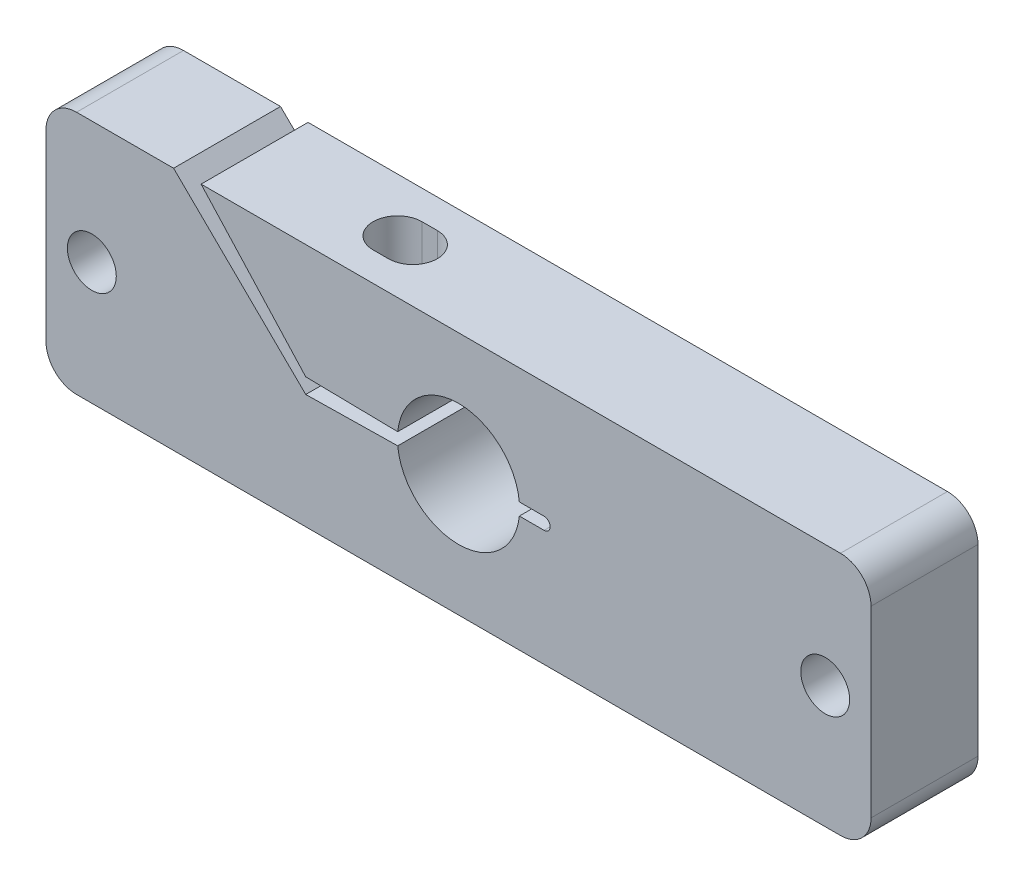
ISO-10303-21;
HEADER;
FILE_DESCRIPTION(('STEP AP214'),'2;1');
FILE_NAME('part.step','',(''),(''),'','','');
FILE_SCHEMA(('AUTOMOTIVE_DESIGN { 1 0 10303 214 1 1 1 1 }'));
ENDSEC;
DATA;
#1=APPLICATION_CONTEXT('core data for automotive mechanical design processes');
#2=APPLICATION_PROTOCOL_DEFINITION('international standard','automotive_design',2000,#1);
#3=PRODUCT_CONTEXT('',#1,'mechanical');
#4=PRODUCT('Part','Part','',(#3));
#5=PRODUCT_RELATED_PRODUCT_CATEGORY('part','',(#4));
#6=PRODUCT_DEFINITION_FORMATION('','',#4);
#7=PRODUCT_DEFINITION_CONTEXT('part definition',#1,'design');
#8=PRODUCT_DEFINITION('design','',#6,#7);
#9=PRODUCT_DEFINITION_SHAPE('','',#8);
#10=(LENGTH_UNIT() NAMED_UNIT(*) SI_UNIT(.MILLI.,.METRE.));
#11=(NAMED_UNIT(*) PLANE_ANGLE_UNIT() SI_UNIT($,.RADIAN.));
#12=(NAMED_UNIT(*) SI_UNIT($,.STERADIAN.) SOLID_ANGLE_UNIT());
#13=UNCERTAINTY_MEASURE_WITH_UNIT(LENGTH_MEASURE(1.E-05),#10,'distance_accuracy_value','');
#14=(GEOMETRIC_REPRESENTATION_CONTEXT(3) GLOBAL_UNCERTAINTY_ASSIGNED_CONTEXT((#13)) GLOBAL_UNIT_ASSIGNED_CONTEXT((#10,
#11,#12)) REPRESENTATION_CONTEXT('',''));
#15=CARTESIAN_POINT('',(0.,0.,0.));
#16=DIRECTION('',(0.,0.,1.));
#17=DIRECTION('',(1.,0.,0.));
#18=AXIS2_PLACEMENT_3D('',#15,#16,#17);
#19=CARTESIAN_POINT('',(5.6,0.,-3.5));
#20=DIRECTION('',(0.,0.,1.));
#21=DIRECTION('',(1.,0.,0.));
#22=AXIS2_PLACEMENT_3D('',#19,#20,#21);
#23=CYLINDRICAL_SURFACE('',#22,0.4);
#24=DIRECTION('',(0.,0.,-1.));
#25=VECTOR('',#24,1.);
#26=CARTESIAN_POINT('',(5.6,0.4,-3.5));
#27=LINE('',#26,#25);
#28=CARTESIAN_POINT('',(5.6,0.4,-3.5));
#29=VERTEX_POINT('',#28);
#30=CARTESIAN_POINT('',(5.6,0.4,3.5));
#31=VERTEX_POINT('',#30);
#32=EDGE_CURVE('E381',#29,#31,#27,.F.);
#33=ORIENTED_EDGE('',*,*,#32,.F.);
#34=CARTESIAN_POINT('',(5.6,0.,-3.5));
#35=DIRECTION('',(0.,0.,1.));
#36=DIRECTION('',(1.,0.,0.));
#37=AXIS2_PLACEMENT_3D('',#34,#35,#36);
#38=CIRCLE('',#37,0.4);
#39=CARTESIAN_POINT('',(5.6,-0.4,-3.5));
#40=VERTEX_POINT('',#39);
#41=EDGE_CURVE('E52',#29,#40,#38,.F.);
#42=ORIENTED_EDGE('',*,*,#41,.T.);
#43=DIRECTION('',(0.,0.,-1.));
#44=VECTOR('',#43,1.);
#45=CARTESIAN_POINT('',(5.6,-0.4,-3.5));
#46=LINE('',#45,#44);
#47=CARTESIAN_POINT('',(5.6,-0.4,3.5));
#48=VERTEX_POINT('',#47);
#49=EDGE_CURVE('E390',#48,#40,#46,.T.);
#50=ORIENTED_EDGE('',*,*,#49,.F.);
#51=CARTESIAN_POINT('',(5.6,0.,3.5));
#52=DIRECTION('',(0.,0.,1.));
#53=DIRECTION('',(1.,0.,0.));
#54=AXIS2_PLACEMENT_3D('',#51,#52,#53);
#55=CIRCLE('',#54,0.4);
#56=EDGE_CURVE('E11',#48,#31,#55,.T.);
#57=ORIENTED_EDGE('',*,*,#56,.T.);
#58=EDGE_LOOP('',(#33,#42,#50,#57));
#59=FACE_BOUND('',#58,.T.);
#60=ADVANCED_FACE('F44',(#59),#23,.F.);
#61=CARTESIAN_POINT('',(-6.98997487421324,8.00100000000001,0.));
#62=DIRECTION('',(0.,-1.,0.));
#63=DIRECTION('',(0.,0.,-1.));
#64=AXIS2_PLACEMENT_3D('',#61,#62,#63);
#65=CYLINDRICAL_SURFACE('',#64,1.6);
#66=CARTESIAN_POINT('',(-6.98997487421324,-0.450000000000001,0.));
#67=DIRECTION('',(-0.0166088657318921,0.99986206327628,0.));
#68=DIRECTION('',(-0.99986206327628,-0.0166088657318921,0.));
#69=AXIS2_PLACEMENT_3D('',#66,#67,#68);
#70=ELLIPSE('',#69,1.60022072920462,1.6);
#71=CARTESIAN_POINT('',(-8.58997487421324,-0.476577851232751,0.));
#72=VERTEX_POINT('',#71);
#73=EDGE_CURVE('E239',#72,#72,#70,.F.);
#74=ORIENTED_EDGE('',*,*,#73,.F.);
#75=EDGE_LOOP('',(#74));
#76=FACE_BOUND('',#75,.T.);
#77=CARTESIAN_POINT('',(-6.98997487421324,-1.99999999999999,0.));
#78=DIRECTION('',(0.,-1.,0.));
#79=DIRECTION('',(0.,0.,-1.));
#80=AXIS2_PLACEMENT_3D('',#77,#78,#79);
#81=CIRCLE('',#80,1.6);
#82=CARTESIAN_POINT('',(-6.98997487421324,-1.99999999999999,-1.6));
#83=VERTEX_POINT('',#82);
#84=EDGE_CURVE('E215',#83,#83,#81,.T.);
#85=ORIENTED_EDGE('',*,*,#84,.T.);
#86=EDGE_LOOP('',(#85));
#87=FACE_BOUND('',#86,.T.);
#88=ADVANCED_FACE('F461',(#76,#87),#65,.F.);
#89=CARTESIAN_POINT('',(0.,0.,-3.5));
#90=DIRECTION('',(0.,0.,1.));
#91=DIRECTION('',(1.,0.,0.));
#92=AXIS2_PLACEMENT_3D('',#89,#90,#91);
#93=CYLINDRICAL_SURFACE('',#92,4.);
#94=DIRECTION('',(0.,0.,1.));
#95=VECTOR('',#94,1.);
#96=CARTESIAN_POINT('',(3.97994974842648,0.4,-3.5));
#97=LINE('',#96,#95);
#98=CARTESIAN_POINT('',(3.97994974842648,0.4,-3.5));
#99=VERTEX_POINT('',#98);
#100=CARTESIAN_POINT('',(3.97994974842648,0.4,3.5));
#101=VERTEX_POINT('',#100);
#102=EDGE_CURVE('E328',#99,#101,#97,.T.);
#103=ORIENTED_EDGE('',*,*,#102,.T.);
#104=CARTESIAN_POINT('',(0.,0.,3.5));
#105=DIRECTION('',(0.,0.,-1.));
#106=DIRECTION('',(1.,0.,0.));
#107=AXIS2_PLACEMENT_3D('',#104,#105,#106);
#108=CIRCLE('',#107,4.);
#109=CARTESIAN_POINT('',(-3.97994974842648,0.4,3.5));
#110=VERTEX_POINT('',#109);
#111=EDGE_CURVE('E252',#110,#101,#108,.T.);
#112=ORIENTED_EDGE('',*,*,#111,.F.);
#113=DIRECTION('',(0.,0.,1.));
#114=VECTOR('',#113,1.);
#115=CARTESIAN_POINT('',(-3.97994974842648,0.4,-3.5));
#116=LINE('',#115,#114);
#117=CARTESIAN_POINT('',(-3.97994974842648,0.4,-3.5));
#118=VERTEX_POINT('',#117);
#119=EDGE_CURVE('E333',#118,#110,#116,.T.);
#120=ORIENTED_EDGE('',*,*,#119,.F.);
#121=CARTESIAN_POINT('',(0.,0.,-3.5));
#122=DIRECTION('',(0.,0.,-1.));
#123=DIRECTION('',(1.,0.,0.));
#124=AXIS2_PLACEMENT_3D('',#121,#122,#123);
#125=CIRCLE('',#124,4.);
#126=EDGE_CURVE('E291',#118,#99,#125,.T.);
#127=ORIENTED_EDGE('',*,*,#126,.T.);
#128=EDGE_LOOP('',(#103,#112,#120,#127));
#129=FACE_BOUND('',#128,.T.);
#130=ADVANCED_FACE('F458',(#129),#93,.F.);
#131=CARTESIAN_POINT('',(-10.,0.5,-3.5));
#132=DIRECTION('',(-0.0166088657318921,-0.99986206327628,0.));
#133=DIRECTION('',(0.99986206327628,-0.0166088657318921,0.));
#134=AXIS2_PLACEMENT_3D('',#131,#132,#133);
#135=PLANE('',#134);
#136=CARTESIAN_POINT('',(-7.48997487421324,0.458305578510235,0.));
#137=DIRECTION('',(-0.0166088657318921,-0.99986206327628,0.));
#138=DIRECTION('',(-0.99986206327628,0.0166088657318921,0.));
#139=AXIS2_PLACEMENT_3D('',#136,#137,#138);
#140=ELLIPSE('',#139,1.60022072920462,1.6);
#141=CARTESIAN_POINT('',(-7.48997487421324,0.458305578510235,-1.6));
#142=VERTEX_POINT('',#141);
#143=CARTESIAN_POINT('',(-7.48997487421324,0.458305578510235,1.6));
#144=VERTEX_POINT('',#143);
#145=EDGE_CURVE('E199',#142,#144,#140,.F.);
#146=ORIENTED_EDGE('',*,*,#145,.T.);
#147=DIRECTION('',(0.99986206327628,-0.0166088657318921,0.));
#148=VECTOR('',#147,1.);
#149=CARTESIAN_POINT('',(-7.34949478371137,0.455972041668659,1.6));
#150=LINE('',#149,#148);
#151=CARTESIAN_POINT('',(-6.48997487421324,0.441694421489766,1.6));
#152=VERTEX_POINT('',#151);
#153=EDGE_CURVE('E222',#144,#152,#150,.T.);
#154=ORIENTED_EDGE('',*,*,#153,.T.);
#155=CARTESIAN_POINT('',(-6.48997487421324,0.441694421489766,0.));
#156=DIRECTION('',(-0.0166088657318921,-0.99986206327628,0.));
#157=DIRECTION('',(-0.99986206327628,0.0166088657318921,0.));
#158=AXIS2_PLACEMENT_3D('',#155,#156,#157);
#159=ELLIPSE('',#158,1.60022072920462,1.6);
#160=CARTESIAN_POINT('',(-6.48997487421324,0.441694421489766,-1.6));
#161=VERTEX_POINT('',#160);
#162=EDGE_CURVE('E203',#152,#161,#159,.F.);
#163=ORIENTED_EDGE('',*,*,#162,.T.);
#164=DIRECTION('',(-0.99986206327628,0.0166088657318921,0.));
#165=VECTOR('',#164,1.);
#166=CARTESIAN_POINT('',(-7.34949478371137,0.455972041668659,-1.6));
#167=LINE('',#166,#165);
#168=EDGE_CURVE('E204',#161,#142,#167,.T.);
#169=ORIENTED_EDGE('',*,*,#168,.T.);
#170=EDGE_LOOP('',(#146,#154,#163,#169));
#171=FACE_BOUND('',#170,.T.);
#172=ORIENTED_EDGE('',*,*,#119,.T.);
#173=DIRECTION('',(0.99986206327628,-0.0166088657318921,0.));
#174=VECTOR('',#173,1.);
#175=CARTESIAN_POINT('',(-10.,0.5,3.5));
#176=LINE('',#175,#174);
#177=CARTESIAN_POINT('',(-10.,0.5,3.5));
#178=VERTEX_POINT('',#177);
#179=EDGE_CURVE('E281',#178,#110,#176,.T.);
#180=ORIENTED_EDGE('',*,*,#179,.F.);
#181=DIRECTION('',(0.,0.,1.));
#182=VECTOR('',#181,1.);
#183=CARTESIAN_POINT('',(-10.,0.5,-3.5));
#184=LINE('',#183,#182);
#185=CARTESIAN_POINT('',(-10.,0.5,-3.5));
#186=VERTEX_POINT('',#185);
#187=EDGE_CURVE('E335',#186,#178,#184,.T.);
#188=ORIENTED_EDGE('',*,*,#187,.F.);
#189=DIRECTION('',(0.99986206327628,-0.0166088657318921,0.));
#190=VECTOR('',#189,1.);
#191=CARTESIAN_POINT('',(-10.,0.5,-3.5));
#192=LINE('',#191,#190);
#193=EDGE_CURVE('E330',#186,#118,#192,.T.);
#194=ORIENTED_EDGE('',*,*,#193,.T.);
#195=EDGE_LOOP('',(#172,#180,#188,#194));
#196=FACE_BOUND('',#195,.T.);
#197=ADVANCED_FACE('F457',(#171,#196),#135,.T.);
#198=CARTESIAN_POINT('',(-10.,0.5,-3.5));
#199=DIRECTION('',(-0.73845534062588,-0.674302387583728,0.));
#200=DIRECTION('',(0.674302387583728,-0.73845534062588,0.));
#201=AXIS2_PLACEMENT_3D('',#198,#199,#200);
#202=PLANE('',#201);
#203=ORIENTED_EDGE('',*,*,#187,.T.);
#204=DIRECTION('',(0.674302387583728,-0.73845534062588,0.));
#205=VECTOR('',#204,1.);
#206=CARTESIAN_POINT('',(-10.,0.5,3.5));
#207=LINE('',#206,#205);
#208=CARTESIAN_POINT('',(-16.8484411021954,8.,3.5));
#209=VERTEX_POINT('',#208);
#210=EDGE_CURVE('E282',#209,#178,#207,.T.);
#211=ORIENTED_EDGE('',*,*,#210,.F.);
#212=DIRECTION('',(0.,0.,1.));
#213=VECTOR('',#212,1.);
#214=CARTESIAN_POINT('',(-16.8484411021954,8.,-3.5));
#215=LINE('',#214,#213);
#216=CARTESIAN_POINT('',(-16.8484411021954,8.,-3.5));
#217=VERTEX_POINT('',#216);
#218=EDGE_CURVE('E337',#217,#209,#215,.T.);
#219=ORIENTED_EDGE('',*,*,#218,.F.);
#220=DIRECTION('',(0.674302387583728,-0.73845534062588,0.));
#221=VECTOR('',#220,1.);
#222=CARTESIAN_POINT('',(-10.,0.5,-3.5));
#223=LINE('',#222,#221);
#224=EDGE_CURVE('E324',#217,#186,#223,.T.);
#225=ORIENTED_EDGE('',*,*,#224,.T.);
#226=EDGE_LOOP('',(#203,#211,#219,#225));
#227=FACE_BOUND('',#226,.T.);
#228=ADVANCED_FACE('F455',(#227),#202,.T.);
#229=CARTESIAN_POINT('',(-16.8484411021954,8.,-3.5));
#230=DIRECTION('',(0.,1.,0.));
#231=DIRECTION('',(-1.,0.,0.));
#232=AXIS2_PLACEMENT_3D('',#229,#230,#231);
#233=PLANE('',#232);
#234=CARTESIAN_POINT('',(-7.48997487421324,8.,0.));
#235=DIRECTION('',(0.,1.,0.));
#236=DIRECTION('',(0.,0.,1.));
#237=AXIS2_PLACEMENT_3D('',#234,#235,#236);
#238=CIRCLE('',#237,1.6);
#239=CARTESIAN_POINT('',(-7.48997487421324,8.,-1.6));
#240=VERTEX_POINT('',#239);
#241=CARTESIAN_POINT('',(-7.48997487421324,8.,1.6));
#242=VERTEX_POINT('',#241);
#243=EDGE_CURVE('E192',#240,#242,#238,.T.);
#244=ORIENTED_EDGE('',*,*,#243,.F.);
#245=DIRECTION('',(-1.,0.,0.));
#246=VECTOR('',#245,1.);
#247=CARTESIAN_POINT('',(-7.48997487421324,8.,-1.6));
#248=LINE('',#247,#246);
#249=CARTESIAN_POINT('',(-6.48997487421324,8.,-1.6));
#250=VERTEX_POINT('',#249);
#251=EDGE_CURVE('E201',#250,#240,#248,.T.);
#252=ORIENTED_EDGE('',*,*,#251,.F.);
#253=CARTESIAN_POINT('',(-6.48997487421324,8.,0.));
#254=DIRECTION('',(0.,1.,0.));
#255=DIRECTION('',(0.,0.,1.));
#256=AXIS2_PLACEMENT_3D('',#253,#254,#255);
#257=CIRCLE('',#256,1.6);
#258=CARTESIAN_POINT('',(-6.48997487421324,8.,1.6));
#259=VERTEX_POINT('',#258);
#260=EDGE_CURVE('E211',#259,#250,#257,.T.);
#261=ORIENTED_EDGE('',*,*,#260,.F.);
#262=DIRECTION('',(1.,0.,0.));
#263=VECTOR('',#262,1.);
#264=CARTESIAN_POINT('',(-7.48997487421324,8.,1.6));
#265=LINE('',#264,#263);
#266=EDGE_CURVE('E216',#242,#259,#265,.T.);
#267=ORIENTED_EDGE('',*,*,#266,.F.);
#268=EDGE_LOOP('',(#244,#252,#261,#267));
#269=FACE_BOUND('',#268,.T.);
#270=DIRECTION('',(-1.,0.,0.));
#271=VECTOR('',#270,1.);
#272=CARTESIAN_POINT('',(-16.8484411021954,8.,3.5));
#273=LINE('',#272,#271);
#274=CARTESIAN_POINT('',(25.,8.00000000000001,3.5));
#275=VERTEX_POINT('',#274);
#276=EDGE_CURVE('E279',#275,#209,#273,.T.);
#277=ORIENTED_EDGE('',*,*,#276,.F.);
#278=DIRECTION('',(0.,0.,1.));
#279=VECTOR('',#278,1.);
#280=CARTESIAN_POINT('',(25.,8.00000000000001,-3.5));
#281=LINE('',#280,#279);
#282=CARTESIAN_POINT('',(25.,8.00000000000001,-3.5));
#283=VERTEX_POINT('',#282);
#284=EDGE_CURVE('E378',#275,#283,#281,.F.);
#285=ORIENTED_EDGE('',*,*,#284,.T.);
#286=DIRECTION('',(-1.,0.,0.));
#287=VECTOR('',#286,1.);
#288=CARTESIAN_POINT('',(-16.8484411021954,8.,-3.5));
#289=LINE('',#288,#287);
#290=EDGE_CURVE('E325',#283,#217,#289,.T.);
#291=ORIENTED_EDGE('',*,*,#290,.T.);
#292=ORIENTED_EDGE('',*,*,#218,.T.);
#293=EDGE_LOOP('',(#277,#285,#291,#292));
#294=FACE_BOUND('',#293,.T.);
#295=ADVANCED_FACE('F217',(#269,#294),#233,.T.);
#296=CARTESIAN_POINT('',(27.,8.00000000000001,-3.5));
#297=DIRECTION('',(1.,0.,0.));
#298=DIRECTION('',(0.,1.,0.));
#299=AXIS2_PLACEMENT_3D('',#296,#297,#298);
#300=PLANE('',#299);
#301=DIRECTION('',(0.,1.,0.));
#302=VECTOR('',#301,1.);
#303=CARTESIAN_POINT('',(27.,8.00000000000001,3.5));
#304=LINE('',#303,#302);
#305=CARTESIAN_POINT('',(27.,-5.99999999999999,3.5));
#306=VERTEX_POINT('',#305);
#307=CARTESIAN_POINT('',(27.,6.00000000000001,3.5));
#308=VERTEX_POINT('',#307);
#309=EDGE_CURVE('E278',#306,#308,#304,.T.);
#310=ORIENTED_EDGE('',*,*,#309,.F.);
#311=DIRECTION('',(0.,0.,1.));
#312=VECTOR('',#311,1.);
#313=CARTESIAN_POINT('',(27.,-5.99999999999999,-3.5));
#314=LINE('',#313,#312);
#315=CARTESIAN_POINT('',(27.,-5.99999999999999,-3.5));
#316=VERTEX_POINT('',#315);
#317=EDGE_CURVE('E380',#306,#316,#314,.F.);
#318=ORIENTED_EDGE('',*,*,#317,.T.);
#319=DIRECTION('',(0.,1.,0.));
#320=VECTOR('',#319,1.);
#321=CARTESIAN_POINT('',(27.,8.00000000000001,-3.5));
#322=LINE('',#321,#320);
#323=CARTESIAN_POINT('',(27.,6.00000000000001,-3.5));
#324=VERTEX_POINT('',#323);
#325=EDGE_CURVE('E316',#316,#324,#322,.T.);
#326=ORIENTED_EDGE('',*,*,#325,.T.);
#327=DIRECTION('',(0.,0.,1.));
#328=VECTOR('',#327,1.);
#329=CARTESIAN_POINT('',(27.,6.00000000000001,-3.5));
#330=LINE('',#329,#328);
#331=EDGE_CURVE('E372',#324,#308,#330,.T.);
#332=ORIENTED_EDGE('',*,*,#331,.T.);
#333=EDGE_LOOP('',(#310,#318,#326,#332));
#334=FACE_BOUND('',#333,.T.);
#335=ADVANCED_FACE('F437',(#334),#300,.T.);
#336=CARTESIAN_POINT('',(-27.,-8.,-3.5));
#337=DIRECTION('',(0.,-1.,0.));
#338=DIRECTION('',(1.,0.,0.));
#339=AXIS2_PLACEMENT_3D('',#336,#337,#338);
#340=PLANE('',#339);
#341=CARTESIAN_POINT('',(-6.98997487421324,-7.99999999999999,0.));
#342=DIRECTION('',(0.,-1.,0.));
#343=DIRECTION('',(0.,0.,-1.));
#344=AXIS2_PLACEMENT_3D('',#341,#342,#343);
#345=CIRCLE('',#344,2.2);
#346=CARTESIAN_POINT('',(-6.98997487421324,-7.99999999999999,-2.2));
#347=VERTEX_POINT('',#346);
#348=EDGE_CURVE('E236',#347,#347,#345,.T.);
#349=ORIENTED_EDGE('',*,*,#348,.F.);
#350=EDGE_LOOP('',(#349));
#351=FACE_BOUND('',#350,.T.);
#352=DIRECTION('',(1.,0.,0.));
#353=VECTOR('',#352,1.);
#354=CARTESIAN_POINT('',(-27.,-8.,3.5));
#355=LINE('',#354,#353);
#356=CARTESIAN_POINT('',(-25.,-8.,3.5));
#357=VERTEX_POINT('',#356);
#358=CARTESIAN_POINT('',(25.,-7.99999999999999,3.5));
#359=VERTEX_POINT('',#358);
#360=EDGE_CURVE('E271',#357,#359,#355,.T.);
#361=ORIENTED_EDGE('',*,*,#360,.F.);
#362=DIRECTION('',(0.,0.,1.));
#363=VECTOR('',#362,1.);
#364=CARTESIAN_POINT('',(-25.,-8.,-3.5));
#365=LINE('',#364,#363);
#366=CARTESIAN_POINT('',(-25.,-8.,-3.5));
#367=VERTEX_POINT('',#366);
#368=EDGE_CURVE('E364',#357,#367,#365,.F.);
#369=ORIENTED_EDGE('',*,*,#368,.T.);
#370=DIRECTION('',(1.,0.,0.));
#371=VECTOR('',#370,1.);
#372=CARTESIAN_POINT('',(-27.,-8.,-3.5));
#373=LINE('',#372,#371);
#374=CARTESIAN_POINT('',(25.,-7.99999999999999,-3.5));
#375=VERTEX_POINT('',#374);
#376=EDGE_CURVE('E317',#367,#375,#373,.T.);
#377=ORIENTED_EDGE('',*,*,#376,.T.);
#378=DIRECTION('',(0.,0.,1.));
#379=VECTOR('',#378,1.);
#380=CARTESIAN_POINT('',(25.,-7.99999999999999,-3.5));
#381=LINE('',#380,#379);
#382=EDGE_CURVE('E363',#375,#359,#381,.T.);
#383=ORIENTED_EDGE('',*,*,#382,.T.);
#384=EDGE_LOOP('',(#361,#369,#377,#383));
#385=FACE_BOUND('',#384,.T.);
#386=ADVANCED_FACE('F431',(#351,#385),#340,.T.);
#387=CARTESIAN_POINT('',(-27.,8.,-3.5));
#388=DIRECTION('',(-1.,0.,0.));
#389=DIRECTION('',(0.,0.,1.));
#390=AXIS2_PLACEMENT_3D('',#387,#388,#389);
#391=PLANE('',#390);
#392=DIRECTION('',(0.,-1.,0.));
#393=VECTOR('',#392,1.);
#394=CARTESIAN_POINT('',(-27.,8.,-3.5));
#395=LINE('',#394,#393);
#396=CARTESIAN_POINT('',(-27.,6.,-3.5));
#397=VERTEX_POINT('',#396);
#398=CARTESIAN_POINT('',(-27.,-6.,-3.5));
#399=VERTEX_POINT('',#398);
#400=EDGE_CURVE('E312',#397,#399,#395,.T.);
#401=ORIENTED_EDGE('',*,*,#400,.T.);
#402=DIRECTION('',(0.,0.,1.));
#403=VECTOR('',#402,1.);
#404=CARTESIAN_POINT('',(-27.,-6.,-3.5));
#405=LINE('',#404,#403);
#406=CARTESIAN_POINT('',(-27.,-6.,3.5));
#407=VERTEX_POINT('',#406);
#408=EDGE_CURVE('E348',#399,#407,#405,.T.);
#409=ORIENTED_EDGE('',*,*,#408,.T.);
#410=DIRECTION('',(0.,-1.,0.));
#411=VECTOR('',#410,1.);
#412=CARTESIAN_POINT('',(-27.,8.,3.5));
#413=LINE('',#412,#411);
#414=CARTESIAN_POINT('',(-27.,6.,3.5));
#415=VERTEX_POINT('',#414);
#416=EDGE_CURVE('E266',#415,#407,#413,.T.);
#417=ORIENTED_EDGE('',*,*,#416,.F.);
#418=DIRECTION('',(0.,0.,1.));
#419=VECTOR('',#418,1.);
#420=CARTESIAN_POINT('',(-27.,6.,-3.5));
#421=LINE('',#420,#419);
#422=EDGE_CURVE('E332',#415,#397,#421,.F.);
#423=ORIENTED_EDGE('',*,*,#422,.T.);
#424=EDGE_LOOP('',(#401,#409,#417,#423));
#425=FACE_BOUND('',#424,.T.);
#426=ADVANCED_FACE('F421',(#425),#391,.T.);
#427=CARTESIAN_POINT('',(-27.,8.,-3.5));
#428=DIRECTION('',(0.,1.,0.));
#429=DIRECTION('',(-1.,0.,0.));
#430=AXIS2_PLACEMENT_3D('',#427,#428,#429);
#431=PLANE('',#430);
#432=DIRECTION('',(-1.,0.,0.));
#433=VECTOR('',#432,1.);
#434=CARTESIAN_POINT('',(-27.,8.,-3.5));
#435=LINE('',#434,#433);
#436=CARTESIAN_POINT('',(-18.6496628402632,8.,-3.5));
#437=VERTEX_POINT('',#436);
#438=CARTESIAN_POINT('',(-25.,8.,-3.5));
#439=VERTEX_POINT('',#438);
#440=EDGE_CURVE('E309',#437,#439,#435,.T.);
#441=ORIENTED_EDGE('',*,*,#440,.T.);
#442=DIRECTION('',(0.,0.,1.));
#443=VECTOR('',#442,1.);
#444=CARTESIAN_POINT('',(-25.,8.,-3.5));
#445=LINE('',#444,#443);
#446=CARTESIAN_POINT('',(-25.,8.,3.5));
#447=VERTEX_POINT('',#446);
#448=EDGE_CURVE('E382',#439,#447,#445,.T.);
#449=ORIENTED_EDGE('',*,*,#448,.T.);
#450=DIRECTION('',(-1.,0.,0.));
#451=VECTOR('',#450,1.);
#452=CARTESIAN_POINT('',(-27.,8.,3.5));
#453=LINE('',#452,#451);
#454=CARTESIAN_POINT('',(-18.6496628402632,8.,3.5));
#455=VERTEX_POINT('',#454);
#456=EDGE_CURVE('E269',#455,#447,#453,.T.);
#457=ORIENTED_EDGE('',*,*,#456,.F.);
#458=DIRECTION('',(0.,0.,1.));
#459=VECTOR('',#458,1.);
#460=CARTESIAN_POINT('',(-18.6496628402632,8.,-3.5));
#461=LINE('',#460,#459);
#462=EDGE_CURVE('E339',#437,#455,#461,.T.);
#463=ORIENTED_EDGE('',*,*,#462,.F.);
#464=EDGE_LOOP('',(#441,#449,#457,#463));
#465=FACE_BOUND('',#464,.T.);
#466=ADVANCED_FACE('F418',(#465),#431,.T.);
#467=CARTESIAN_POINT('',(-10.,-0.5,-3.5));
#468=DIRECTION('',(0.700909264299847,0.713250449154186,0.));
#469=DIRECTION('',(-0.713250449154186,0.700909264299847,0.));
#470=AXIS2_PLACEMENT_3D('',#467,#468,#469);
#471=PLANE('',#470);
#472=ORIENTED_EDGE('',*,*,#462,.T.);
#473=DIRECTION('',(-0.713250449154186,0.700909264299847,0.));
#474=VECTOR('',#473,1.);
#475=CARTESIAN_POINT('',(-10.,-0.5,3.5));
#476=LINE('',#475,#474);
#477=CARTESIAN_POINT('',(-10.,-0.5,3.5));
#478=VERTEX_POINT('',#477);
#479=EDGE_CURVE('E261',#478,#455,#476,.T.);
#480=ORIENTED_EDGE('',*,*,#479,.F.);
#481=DIRECTION('',(0.,0.,1.));
#482=VECTOR('',#481,1.);
#483=CARTESIAN_POINT('',(-10.,-0.5,-3.5));
#484=LINE('',#483,#482);
#485=CARTESIAN_POINT('',(-10.,-0.5,-3.5));
#486=VERTEX_POINT('',#485);
#487=EDGE_CURVE('E343',#486,#478,#484,.T.);
#488=ORIENTED_EDGE('',*,*,#487,.F.);
#489=DIRECTION('',(-0.713250449154186,0.700909264299847,0.));
#490=VECTOR('',#489,1.);
#491=CARTESIAN_POINT('',(-10.,-0.5,-3.5));
#492=LINE('',#491,#490);
#493=EDGE_CURVE('E310',#486,#437,#492,.T.);
#494=ORIENTED_EDGE('',*,*,#493,.T.);
#495=EDGE_LOOP('',(#472,#480,#488,#494));
#496=FACE_BOUND('',#495,.T.);
#497=ADVANCED_FACE('F407',(#496),#471,.T.);
#498=CARTESIAN_POINT('',(-10.,-0.5,-3.5));
#499=DIRECTION('',(-0.0166088657318921,0.99986206327628,0.));
#500=DIRECTION('',(-0.99986206327628,-0.0166088657318921,0.));
#501=AXIS2_PLACEMENT_3D('',#498,#499,#500);
#502=PLANE('',#501);
#503=ORIENTED_EDGE('',*,*,#73,.T.);
#504=EDGE_LOOP('',(#503));
#505=FACE_BOUND('',#504,.T.);
#506=ORIENTED_EDGE('',*,*,#487,.T.);
#507=DIRECTION('',(-0.99986206327628,-0.0166088657318921,0.));
#508=VECTOR('',#507,1.);
#509=CARTESIAN_POINT('',(-10.,-0.5,3.5));
#510=LINE('',#509,#508);
#511=CARTESIAN_POINT('',(-3.97994974842648,-0.399999999999999,3.5));
#512=VERTEX_POINT('',#511);
#513=EDGE_CURVE('E262',#512,#478,#510,.T.);
#514=ORIENTED_EDGE('',*,*,#513,.F.);
#515=DIRECTION('',(0.,0.,1.));
#516=VECTOR('',#515,1.);
#517=CARTESIAN_POINT('',(-3.97994974842648,-0.399999999999999,-3.5));
#518=LINE('',#517,#516);
#519=CARTESIAN_POINT('',(-3.97994974842648,-0.399999999999999,-3.5));
#520=VERTEX_POINT('',#519);
#521=EDGE_CURVE('E341',#520,#512,#518,.T.);
#522=ORIENTED_EDGE('',*,*,#521,.F.);
#523=DIRECTION('',(-0.99986206327628,-0.0166088657318921,0.));
#524=VECTOR('',#523,1.);
#525=CARTESIAN_POINT('',(-10.,-0.5,-3.5));
#526=LINE('',#525,#524);
#527=EDGE_CURVE('E302',#520,#486,#526,.T.);
#528=ORIENTED_EDGE('',*,*,#527,.T.);
#529=EDGE_LOOP('',(#506,#514,#522,#528));
#530=FACE_BOUND('',#529,.T.);
#531=ADVANCED_FACE('F406',(#505,#530),#502,.T.);
#532=CARTESIAN_POINT('',(0.,0.,-3.5));
#533=DIRECTION('',(0.,0.,1.));
#534=DIRECTION('',(1.,0.,0.));
#535=AXIS2_PLACEMENT_3D('',#532,#533,#534);
#536=CYLINDRICAL_SURFACE('',#535,4.);
#537=ORIENTED_EDGE('',*,*,#521,.T.);
#538=CARTESIAN_POINT('',(0.,0.,3.5));
#539=DIRECTION('',(0.,0.,-1.));
#540=DIRECTION('',(1.,0.,0.));
#541=AXIS2_PLACEMENT_3D('',#538,#539,#540);
#542=CIRCLE('',#541,4.);
#543=CARTESIAN_POINT('',(3.97994974842648,-0.4,3.5));
#544=VERTEX_POINT('',#543);
#545=EDGE_CURVE('E256',#544,#512,#542,.T.);
#546=ORIENTED_EDGE('',*,*,#545,.F.);
#547=DIRECTION('',(0.,0.,1.));
#548=VECTOR('',#547,1.);
#549=CARTESIAN_POINT('',(3.97994974842648,-0.4,-3.5));
#550=LINE('',#549,#548);
#551=CARTESIAN_POINT('',(3.97994974842648,-0.4,-3.5));
#552=VERTEX_POINT('',#551);
#553=EDGE_CURVE('E342',#552,#544,#550,.T.);
#554=ORIENTED_EDGE('',*,*,#553,.F.);
#555=CARTESIAN_POINT('',(0.,0.,-3.5));
#556=DIRECTION('',(0.,0.,-1.));
#557=DIRECTION('',(1.,0.,0.));
#558=AXIS2_PLACEMENT_3D('',#555,#556,#557);
#559=CIRCLE('',#558,4.);
#560=EDGE_CURVE('E301',#552,#520,#559,.T.);
#561=ORIENTED_EDGE('',*,*,#560,.T.);
#562=EDGE_LOOP('',(#537,#546,#554,#561));
#563=FACE_BOUND('',#562,.T.);
#564=ADVANCED_FACE('F402',(#563),#536,.F.);
#565=CARTESIAN_POINT('',(3.97994974842648,-0.4,-3.5));
#566=DIRECTION('',(0.,1.,0.));
#567=DIRECTION('',(0.,0.,1.));
#568=AXIS2_PLACEMENT_3D('',#565,#566,#567);
#569=PLANE('',#568);
#570=DIRECTION('',(-1.,0.,0.));
#571=VECTOR('',#570,1.);
#572=CARTESIAN_POINT('',(3.97994974842648,-0.4,3.5));
#573=LINE('',#572,#571);
#574=EDGE_CURVE('E258',#48,#544,#573,.T.);
#575=ORIENTED_EDGE('',*,*,#574,.F.);
#576=ORIENTED_EDGE('',*,*,#49,.T.);
#577=DIRECTION('',(-1.,0.,0.));
#578=VECTOR('',#577,1.);
#579=CARTESIAN_POINT('',(3.97994974842648,-0.4,-3.5));
#580=LINE('',#579,#578);
#581=EDGE_CURVE('E299',#40,#552,#580,.T.);
#582=ORIENTED_EDGE('',*,*,#581,.T.);
#583=ORIENTED_EDGE('',*,*,#553,.T.);
#584=EDGE_LOOP('',(#575,#576,#582,#583));
#585=FACE_BOUND('',#584,.T.);
#586=ADVANCED_FACE('F392',(#585),#569,.T.);
#587=CARTESIAN_POINT('',(3.97994974842648,0.4,-3.5));
#588=DIRECTION('',(0.,-1.,0.));
#589=DIRECTION('',(0.,0.,-1.));
#590=AXIS2_PLACEMENT_3D('',#587,#588,#589);
#591=PLANE('',#590);
#592=DIRECTION('',(1.,0.,0.));
#593=VECTOR('',#592,1.);
#594=CARTESIAN_POINT('',(3.97994974842648,0.4,-3.5));
#595=LINE('',#594,#593);
#596=EDGE_CURVE('E298',#99,#29,#595,.T.);
#597=ORIENTED_EDGE('',*,*,#596,.T.);
#598=ORIENTED_EDGE('',*,*,#32,.T.);
#599=DIRECTION('',(1.,0.,0.));
#600=VECTOR('',#599,1.);
#601=CARTESIAN_POINT('',(3.97994974842648,0.4,3.5));
#602=LINE('',#601,#600);
#603=EDGE_CURVE('E251',#101,#31,#602,.T.);
#604=ORIENTED_EDGE('',*,*,#603,.F.);
#605=ORIENTED_EDGE('',*,*,#102,.F.);
#606=EDGE_LOOP('',(#597,#598,#604,#605));
#607=FACE_BOUND('',#606,.T.);
#608=ADVANCED_FACE('F464',(#607),#591,.T.);
#609=CARTESIAN_POINT('',(0.,0.,-3.5));
#610=DIRECTION('',(0.,0.,1.));
#611=DIRECTION('',(1.,0.,0.));
#612=AXIS2_PLACEMENT_3D('',#609,#610,#611);
#613=PLANE('',#612);
#614=CARTESIAN_POINT('',(24.,0.,-3.5));
#615=DIRECTION('',(0.,0.,1.));
#616=DIRECTION('',(-1.,0.,0.));
#617=AXIS2_PLACEMENT_3D('',#614,#615,#616);
#618=CIRCLE('',#617,1.60000000000001);
#619=CARTESIAN_POINT('',(22.4,0.,-3.5));
#620=VERTEX_POINT('',#619);
#621=EDGE_CURVE('E289',#620,#620,#618,.T.);
#622=ORIENTED_EDGE('',*,*,#621,.T.);
#623=EDGE_LOOP('',(#622));
#624=FACE_BOUND('',#623,.T.);
#625=CARTESIAN_POINT('',(-24.,0.,-3.5));
#626=DIRECTION('',(0.,0.,1.));
#627=DIRECTION('',(1.,0.,0.));
#628=AXIS2_PLACEMENT_3D('',#625,#626,#627);
#629=CIRCLE('',#628,1.6);
#630=CARTESIAN_POINT('',(-22.4,0.,-3.5));
#631=VERTEX_POINT('',#630);
#632=EDGE_CURVE('E286',#631,#631,#629,.T.);
#633=ORIENTED_EDGE('',*,*,#632,.T.);
#634=EDGE_LOOP('',(#633));
#635=FACE_BOUND('',#634,.T.);
#636=ORIENTED_EDGE('',*,*,#376,.F.);
#637=CARTESIAN_POINT('',(-25.,-6.,-3.5));
#638=DIRECTION('',(0.,0.,1.));
#639=DIRECTION('',(1.,0.,0.));
#640=AXIS2_PLACEMENT_3D('',#637,#638,#639);
#641=CIRCLE('',#640,2.);
#642=EDGE_CURVE('E375',#367,#399,#641,.F.);
#643=ORIENTED_EDGE('',*,*,#642,.T.);
#644=ORIENTED_EDGE('',*,*,#400,.F.);
#645=CARTESIAN_POINT('',(-25.,6.,-3.5));
#646=DIRECTION('',(0.,0.,1.));
#647=DIRECTION('',(1.,0.,0.));
#648=AXIS2_PLACEMENT_3D('',#645,#646,#647);
#649=CIRCLE('',#648,2.);
#650=EDGE_CURVE('E366',#397,#439,#649,.F.);
#651=ORIENTED_EDGE('',*,*,#650,.T.);
#652=ORIENTED_EDGE('',*,*,#440,.F.);
#653=ORIENTED_EDGE('',*,*,#493,.F.);
#654=ORIENTED_EDGE('',*,*,#527,.F.);
#655=ORIENTED_EDGE('',*,*,#560,.F.);
#656=ORIENTED_EDGE('',*,*,#581,.F.);
#657=ORIENTED_EDGE('',*,*,#41,.F.);
#658=ORIENTED_EDGE('',*,*,#596,.F.);
#659=ORIENTED_EDGE('',*,*,#126,.F.);
#660=ORIENTED_EDGE('',*,*,#193,.F.);
#661=ORIENTED_EDGE('',*,*,#224,.F.);
#662=ORIENTED_EDGE('',*,*,#290,.F.);
#663=CARTESIAN_POINT('',(25.,6.00000000000001,-3.5));
#664=DIRECTION('',(0.,0.,1.));
#665=DIRECTION('',(1.,0.,0.));
#666=AXIS2_PLACEMENT_3D('',#663,#664,#665);
#667=CIRCLE('',#666,2.);
#668=EDGE_CURVE('E368',#283,#324,#667,.F.);
#669=ORIENTED_EDGE('',*,*,#668,.T.);
#670=ORIENTED_EDGE('',*,*,#325,.F.);
#671=CARTESIAN_POINT('',(25.,-5.99999999999999,-3.5));
#672=DIRECTION('',(0.,0.,1.));
#673=DIRECTION('',(1.,0.,0.));
#674=AXIS2_PLACEMENT_3D('',#671,#672,#673);
#675=CIRCLE('',#674,2.);
#676=EDGE_CURVE('E369',#316,#375,#675,.F.);
#677=ORIENTED_EDGE('',*,*,#676,.T.);
#678=EDGE_LOOP('',(#636,#643,#644,#651,#652,#653,#654,#655,#656,#657,#658,#659,#660,#661,#662,
#669,#670,#677));
#679=FACE_BOUND('',#678,.T.);
#680=ADVANCED_FACE('F398',(#624,#635,#679),#613,.F.);
#681=CARTESIAN_POINT('',(-24.,0.,-3.5));
#682=DIRECTION('',(0.,0.,1.));
#683=DIRECTION('',(1.,0.,0.));
#684=AXIS2_PLACEMENT_3D('',#681,#682,#683);
#685=CYLINDRICAL_SURFACE('',#684,1.6);
#686=ORIENTED_EDGE('',*,*,#632,.F.);
#687=EDGE_LOOP('',(#686));
#688=FACE_BOUND('',#687,.T.);
#689=CARTESIAN_POINT('',(-24.,0.,3.5));
#690=DIRECTION('',(0.,0.,1.));
#691=DIRECTION('',(1.,0.,0.));
#692=AXIS2_PLACEMENT_3D('',#689,#690,#691);
#693=CIRCLE('',#692,1.6);
#694=CARTESIAN_POINT('',(-22.4,0.,3.5));
#695=VERTEX_POINT('',#694);
#696=EDGE_CURVE('E247',#695,#695,#693,.T.);
#697=ORIENTED_EDGE('',*,*,#696,.T.);
#698=EDGE_LOOP('',(#697));
#699=FACE_BOUND('',#698,.T.);
#700=ADVANCED_FACE('F489',(#688,#699),#685,.F.);
#701=CARTESIAN_POINT('',(24.,0.,-3.5));
#702=DIRECTION('',(0.,0.,1.));
#703=DIRECTION('',(1.,0.,0.));
#704=AXIS2_PLACEMENT_3D('',#701,#702,#703);
#705=CYLINDRICAL_SURFACE('',#704,1.60000000000001);
#706=ORIENTED_EDGE('',*,*,#621,.F.);
#707=EDGE_LOOP('',(#706));
#708=FACE_BOUND('',#707,.T.);
#709=CARTESIAN_POINT('',(24.,0.,3.5));
#710=DIRECTION('',(0.,0.,1.));
#711=DIRECTION('',(-1.,0.,0.));
#712=AXIS2_PLACEMENT_3D('',#709,#710,#711);
#713=CIRCLE('',#712,1.60000000000001);
#714=CARTESIAN_POINT('',(22.4,0.,3.5));
#715=VERTEX_POINT('',#714);
#716=EDGE_CURVE('E244',#715,#715,#713,.T.);
#717=ORIENTED_EDGE('',*,*,#716,.T.);
#718=EDGE_LOOP('',(#717));
#719=FACE_BOUND('',#718,.T.);
#720=ADVANCED_FACE('F487',(#708,#719),#705,.F.);
#721=CARTESIAN_POINT('',(0.,0.,3.5));
#722=DIRECTION('',(0.,0.,1.));
#723=DIRECTION('',(1.,0.,0.));
#724=AXIS2_PLACEMENT_3D('',#721,#722,#723);
#725=PLANE('',#724);
#726=ORIENTED_EDGE('',*,*,#56,.F.);
#727=ORIENTED_EDGE('',*,*,#574,.T.);
#728=ORIENTED_EDGE('',*,*,#545,.T.);
#729=ORIENTED_EDGE('',*,*,#513,.T.);
#730=ORIENTED_EDGE('',*,*,#479,.T.);
#731=ORIENTED_EDGE('',*,*,#456,.T.);
#732=CARTESIAN_POINT('',(-25.,6.,3.5));
#733=DIRECTION('',(0.,0.,1.));
#734=DIRECTION('',(1.,0.,0.));
#735=AXIS2_PLACEMENT_3D('',#732,#733,#734);
#736=CIRCLE('',#735,2.);
#737=EDGE_CURVE('E352',#447,#415,#736,.T.);
#738=ORIENTED_EDGE('',*,*,#737,.T.);
#739=ORIENTED_EDGE('',*,*,#416,.T.);
#740=CARTESIAN_POINT('',(-25.,-6.,3.5));
#741=DIRECTION('',(0.,0.,1.));
#742=DIRECTION('',(1.,0.,0.));
#743=AXIS2_PLACEMENT_3D('',#740,#741,#742);
#744=CIRCLE('',#743,2.);
#745=EDGE_CURVE('E360',#407,#357,#744,.T.);
#746=ORIENTED_EDGE('',*,*,#745,.T.);
#747=ORIENTED_EDGE('',*,*,#360,.T.);
#748=CARTESIAN_POINT('',(25.,-5.99999999999999,3.5));
#749=DIRECTION('',(0.,0.,1.));
#750=DIRECTION('',(1.,0.,0.));
#751=AXIS2_PLACEMENT_3D('',#748,#749,#750);
#752=CIRCLE('',#751,2.);
#753=EDGE_CURVE('E357',#359,#306,#752,.T.);
#754=ORIENTED_EDGE('',*,*,#753,.T.);
#755=ORIENTED_EDGE('',*,*,#309,.T.);
#756=CARTESIAN_POINT('',(25.,6.00000000000001,3.5));
#757=DIRECTION('',(0.,0.,1.));
#758=DIRECTION('',(1.,0.,0.));
#759=AXIS2_PLACEMENT_3D('',#756,#757,#758);
#760=CIRCLE('',#759,2.);
#761=EDGE_CURVE('E351',#308,#275,#760,.T.);
#762=ORIENTED_EDGE('',*,*,#761,.T.);
#763=ORIENTED_EDGE('',*,*,#276,.T.);
#764=ORIENTED_EDGE('',*,*,#210,.T.);
#765=ORIENTED_EDGE('',*,*,#179,.T.);
#766=ORIENTED_EDGE('',*,*,#111,.T.);
#767=ORIENTED_EDGE('',*,*,#603,.T.);
#768=EDGE_LOOP('',(#726,#727,#728,#729,#730,#731,#738,#739,#746,#747,#754,#755,#762,#763,#764,
#765,#766,#767));
#769=FACE_BOUND('',#768,.T.);
#770=ORIENTED_EDGE('',*,*,#696,.F.);
#771=EDGE_LOOP('',(#770));
#772=FACE_BOUND('',#771,.T.);
#773=ORIENTED_EDGE('',*,*,#716,.F.);
#774=EDGE_LOOP('',(#773));
#775=FACE_BOUND('',#774,.T.);
#776=ADVANCED_FACE('F404',(#769,#772,#775),#725,.T.);
#777=CARTESIAN_POINT('',(-6.98997487421324,-1.99999999999999,0.));
#778=DIRECTION('',(0.,-1.,0.));
#779=DIRECTION('',(0.,0.,-1.));
#780=AXIS2_PLACEMENT_3D('',#777,#778,#779);
#781=CYLINDRICAL_SURFACE('',#780,2.2);
#782=CARTESIAN_POINT('',(-6.98997487421324,-1.99999999999999,0.));
#783=DIRECTION('',(0.,-1.,0.));
#784=DIRECTION('',(0.,0.,-1.));
#785=AXIS2_PLACEMENT_3D('',#782,#783,#784);
#786=CIRCLE('',#785,2.2);
#787=CARTESIAN_POINT('',(-6.98997487421324,-1.99999999999999,-2.2));
#788=VERTEX_POINT('',#787);
#789=EDGE_CURVE('E240',#788,#788,#786,.T.);
#790=ORIENTED_EDGE('',*,*,#789,.F.);
#791=EDGE_LOOP('',(#790));
#792=FACE_BOUND('',#791,.T.);
#793=ORIENTED_EDGE('',*,*,#348,.T.);
#794=EDGE_LOOP('',(#793));
#795=FACE_BOUND('',#794,.T.);
#796=ADVANCED_FACE('F482',(#792,#795),#781,.F.);
#797=CARTESIAN_POINT('',(-6.98997487421324,-1.99999999999999,0.));
#798=DIRECTION('',(0.,-1.,0.));
#799=DIRECTION('',(0.,0.,-1.));
#800=AXIS2_PLACEMENT_3D('',#797,#798,#799);
#801=PLANE('',#800);
#802=ORIENTED_EDGE('',*,*,#84,.F.);
#803=EDGE_LOOP('',(#802));
#804=FACE_BOUND('',#803,.T.);
#805=ORIENTED_EDGE('',*,*,#789,.T.);
#806=EDGE_LOOP('',(#805));
#807=FACE_BOUND('',#806,.T.);
#808=ADVANCED_FACE('F601',(#804,#807),#801,.T.);
#809=CARTESIAN_POINT('',(-7.48997487421324,-8.001,0.));
#810=DIRECTION('',(0.,1.,0.));
#811=DIRECTION('',(0.,0.,1.));
#812=AXIS2_PLACEMENT_3D('',#809,#810,#811);
#813=CYLINDRICAL_SURFACE('',#812,1.6);
#814=DIRECTION('',(0.,1.,0.));
#815=VECTOR('',#814,1.);
#816=CARTESIAN_POINT('',(-7.48997487421324,-8.001,-1.6));
#817=LINE('',#816,#815);
#818=EDGE_CURVE('E188',#142,#240,#817,.T.);
#819=ORIENTED_EDGE('',*,*,#818,.T.);
#820=ORIENTED_EDGE('',*,*,#243,.T.);
#821=DIRECTION('',(0.,1.,0.));
#822=VECTOR('',#821,1.);
#823=CARTESIAN_POINT('',(-7.48997487421324,-8.001,1.6));
#824=LINE('',#823,#822);
#825=EDGE_CURVE('E226',#144,#242,#824,.T.);
#826=ORIENTED_EDGE('',*,*,#825,.F.);
#827=ORIENTED_EDGE('',*,*,#145,.F.);
#828=EDGE_LOOP('',(#819,#820,#826,#827));
#829=FACE_BOUND('',#828,.T.);
#830=ADVANCED_FACE('F195',(#829),#813,.F.);
#831=CARTESIAN_POINT('',(-7.48997487421324,-8.001,-1.6));
#832=DIRECTION('',(0.,0.,-1.));
#833=DIRECTION('',(-1.,0.,0.));
#834=AXIS2_PLACEMENT_3D('',#831,#832,#833);
#835=PLANE('',#834);
#836=DIRECTION('',(0.,1.,0.));
#837=VECTOR('',#836,1.);
#838=CARTESIAN_POINT('',(-6.48997487421324,-8.001,-1.6));
#839=LINE('',#838,#837);
#840=EDGE_CURVE('E206',#161,#250,#839,.T.);
#841=ORIENTED_EDGE('',*,*,#840,.T.);
#842=ORIENTED_EDGE('',*,*,#251,.T.);
#843=ORIENTED_EDGE('',*,*,#818,.F.);
#844=ORIENTED_EDGE('',*,*,#168,.F.);
#845=EDGE_LOOP('',(#841,#842,#843,#844));
#846=FACE_BOUND('',#845,.T.);
#847=ADVANCED_FACE('F207',(#846),#835,.F.);
#848=CARTESIAN_POINT('',(-6.48997487421324,-8.001,0.));
#849=DIRECTION('',(0.,1.,0.));
#850=DIRECTION('',(0.,0.,1.));
#851=AXIS2_PLACEMENT_3D('',#848,#849,#850);
#852=CYLINDRICAL_SURFACE('',#851,1.6);
#853=DIRECTION('',(0.,1.,0.));
#854=VECTOR('',#853,1.);
#855=CARTESIAN_POINT('',(-6.48997487421324,-8.001,1.6));
#856=LINE('',#855,#854);
#857=EDGE_CURVE('E218',#152,#259,#856,.T.);
#858=ORIENTED_EDGE('',*,*,#857,.T.);
#859=ORIENTED_EDGE('',*,*,#260,.T.);
#860=ORIENTED_EDGE('',*,*,#840,.F.);
#861=ORIENTED_EDGE('',*,*,#162,.F.);
#862=EDGE_LOOP('',(#858,#859,#860,#861));
#863=FACE_BOUND('',#862,.T.);
#864=ADVANCED_FACE('F578',(#863),#852,.F.);
#865=CARTESIAN_POINT('',(-7.48997487421324,-8.001,1.6));
#866=DIRECTION('',(0.,0.,1.));
#867=DIRECTION('',(1.,0.,0.));
#868=AXIS2_PLACEMENT_3D('',#865,#866,#867);
#869=PLANE('',#868);
#870=ORIENTED_EDGE('',*,*,#825,.T.);
#871=ORIENTED_EDGE('',*,*,#266,.T.);
#872=ORIENTED_EDGE('',*,*,#857,.F.);
#873=ORIENTED_EDGE('',*,*,#153,.F.);
#874=EDGE_LOOP('',(#870,#871,#872,#873));
#875=FACE_BOUND('',#874,.T.);
#876=ADVANCED_FACE('F523',(#875),#869,.F.);
#877=CARTESIAN_POINT('',(-25.,-6.,-3.5));
#878=DIRECTION('',(0.,0.,1.));
#879=DIRECTION('',(1.,0.,0.));
#880=AXIS2_PLACEMENT_3D('',#877,#878,#879);
#881=CYLINDRICAL_SURFACE('',#880,2.);
#882=ORIENTED_EDGE('',*,*,#642,.F.);
#883=ORIENTED_EDGE('',*,*,#368,.F.);
#884=ORIENTED_EDGE('',*,*,#745,.F.);
#885=ORIENTED_EDGE('',*,*,#408,.F.);
#886=EDGE_LOOP('',(#882,#883,#884,#885));
#887=FACE_BOUND('',#886,.T.);
#888=ADVANCED_FACE('F430',(#887),#881,.T.);
#889=CARTESIAN_POINT('',(25.,-5.99999999999999,-3.5));
#890=DIRECTION('',(0.,0.,1.));
#891=DIRECTION('',(1.,0.,0.));
#892=AXIS2_PLACEMENT_3D('',#889,#890,#891);
#893=CYLINDRICAL_SURFACE('',#892,2.);
#894=ORIENTED_EDGE('',*,*,#676,.F.);
#895=ORIENTED_EDGE('',*,*,#317,.F.);
#896=ORIENTED_EDGE('',*,*,#753,.F.);
#897=ORIENTED_EDGE('',*,*,#382,.F.);
#898=EDGE_LOOP('',(#894,#895,#896,#897));
#899=FACE_BOUND('',#898,.T.);
#900=ADVANCED_FACE('F434',(#899),#893,.T.);
#901=CARTESIAN_POINT('',(25.,6.00000000000001,-3.5));
#902=DIRECTION('',(0.,0.,1.));
#903=DIRECTION('',(1.,0.,0.));
#904=AXIS2_PLACEMENT_3D('',#901,#902,#903);
#905=CYLINDRICAL_SURFACE('',#904,2.);
#906=ORIENTED_EDGE('',*,*,#668,.F.);
#907=ORIENTED_EDGE('',*,*,#284,.F.);
#908=ORIENTED_EDGE('',*,*,#761,.F.);
#909=ORIENTED_EDGE('',*,*,#331,.F.);
#910=EDGE_LOOP('',(#906,#907,#908,#909));
#911=FACE_BOUND('',#910,.T.);
#912=ADVANCED_FACE('F443',(#911),#905,.T.);
#913=CARTESIAN_POINT('',(-25.,6.,-3.5));
#914=DIRECTION('',(0.,0.,1.));
#915=DIRECTION('',(1.,0.,0.));
#916=AXIS2_PLACEMENT_3D('',#913,#914,#915);
#917=CYLINDRICAL_SURFACE('',#916,2.);
#918=ORIENTED_EDGE('',*,*,#650,.F.);
#919=ORIENTED_EDGE('',*,*,#422,.F.);
#920=ORIENTED_EDGE('',*,*,#737,.F.);
#921=ORIENTED_EDGE('',*,*,#448,.F.);
#922=EDGE_LOOP('',(#918,#919,#920,#921));
#923=FACE_BOUND('',#922,.T.);
#924=ADVANCED_FACE('F420',(#923),#917,.T.);
#925=CLOSED_SHELL('',(#60,#88,#130,#197,#228,#295,#335,#386,#426,#466,#497,#531,#564,#586,#608,
#680,#700,#720,#776,#796,#808,#830,#847,#864,#876,#888,#900,#912,#924));
#926=MANIFOLD_SOLID_BREP('B2',#925);
#927=ADVANCED_BREP_SHAPE_REPRESENTATION('',(#18,#926),#14);
#928=SHAPE_DEFINITION_REPRESENTATION(#9,#927);
ENDSEC;
END-ISO-10303-21;
